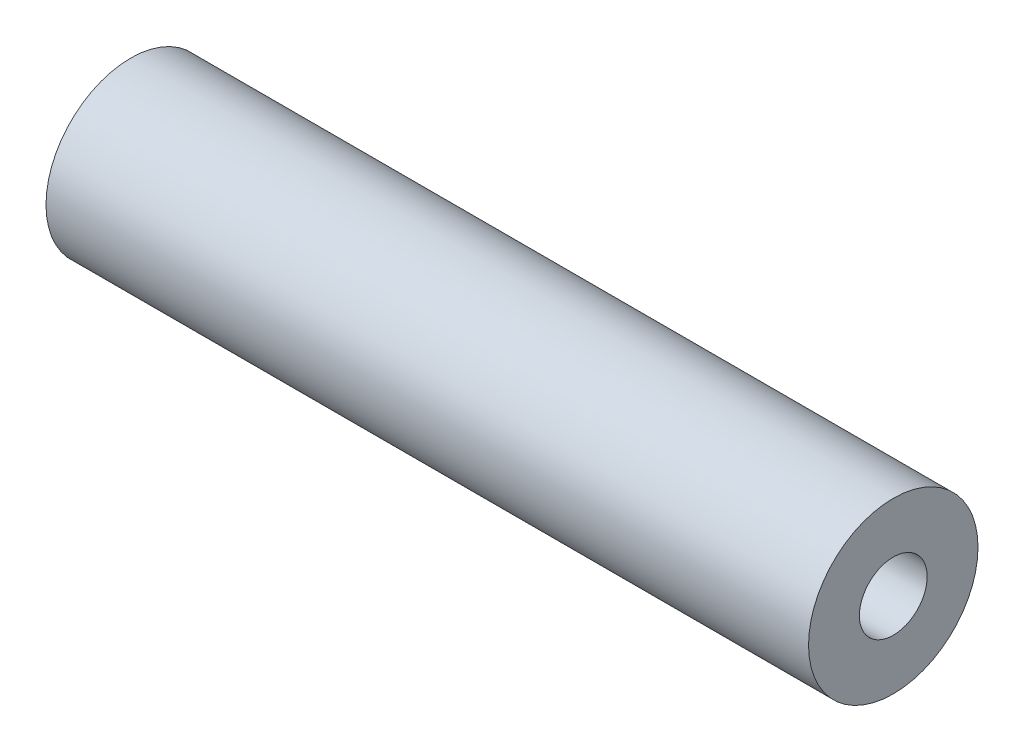
ISO-10303-21;
HEADER;
FILE_DESCRIPTION(('STEP AP214'),'2;1');
FILE_NAME('part.step','',(''),(''),'','','');
FILE_SCHEMA(('AUTOMOTIVE_DESIGN { 1 0 10303 214 1 1 1 1 }'));
ENDSEC;
DATA;
#1=APPLICATION_CONTEXT('core data for automotive mechanical design processes');
#2=APPLICATION_PROTOCOL_DEFINITION('international standard','automotive_design',2000,#1);
#3=PRODUCT_CONTEXT('',#1,'mechanical');
#4=PRODUCT('Part','Part','',(#3));
#5=PRODUCT_RELATED_PRODUCT_CATEGORY('part','',(#4));
#6=PRODUCT_DEFINITION_FORMATION('','',#4);
#7=PRODUCT_DEFINITION_CONTEXT('part definition',#1,'design');
#8=PRODUCT_DEFINITION('design','',#6,#7);
#9=PRODUCT_DEFINITION_SHAPE('','',#8);
#10=(LENGTH_UNIT() NAMED_UNIT(*) SI_UNIT(.MILLI.,.METRE.));
#11=(NAMED_UNIT(*) PLANE_ANGLE_UNIT() SI_UNIT($,.RADIAN.));
#12=(NAMED_UNIT(*) SI_UNIT($,.STERADIAN.) SOLID_ANGLE_UNIT());
#13=UNCERTAINTY_MEASURE_WITH_UNIT(LENGTH_MEASURE(1.E-05),#10,'distance_accuracy_value','');
#14=(GEOMETRIC_REPRESENTATION_CONTEXT(3) GLOBAL_UNCERTAINTY_ASSIGNED_CONTEXT((#13)) GLOBAL_UNIT_ASSIGNED_CONTEXT((#10,
#11,#12)) REPRESENTATION_CONTEXT('',''));
#15=CARTESIAN_POINT('',(0.,0.,0.));
#16=DIRECTION('',(0.,0.,1.));
#17=DIRECTION('',(1.,0.,0.));
#18=AXIS2_PLACEMENT_3D('',#15,#16,#17);
#19=CARTESIAN_POINT('',(-45.,10.,0.));
#20=DIRECTION('',(1.,0.,0.));
#21=DIRECTION('',(0.,0.,-1.));
#22=AXIS2_PLACEMENT_3D('',#19,#20,#21);
#23=PLANE('',#22);
#24=CARTESIAN_POINT('',(-45.,0.,0.));
#25=DIRECTION('',(-1.,0.,0.));
#26=DIRECTION('',(0.,0.,1.));
#27=AXIS2_PLACEMENT_3D('',#24,#25,#26);
#28=CIRCLE('',#27,4.);
#29=CARTESIAN_POINT('',(-45.,0.,4.));
#30=VERTEX_POINT('',#29);
#31=EDGE_CURVE('E10',#30,#30,#28,.T.);
#32=ORIENTED_EDGE('',*,*,#31,.F.);
#33=EDGE_LOOP('',(#32));
#34=FACE_BOUND('',#33,.T.);
#35=CARTESIAN_POINT('',(-45.,0.,0.));
#36=DIRECTION('',(-1.,0.,0.));
#37=DIRECTION('',(0.,0.,1.));
#38=AXIS2_PLACEMENT_3D('',#35,#36,#37);
#39=CIRCLE('',#38,10.);
#40=CARTESIAN_POINT('',(-45.,0.,10.));
#41=VERTEX_POINT('',#40);
#42=EDGE_CURVE('E46',#41,#41,#39,.T.);
#43=ORIENTED_EDGE('',*,*,#42,.T.);
#44=EDGE_LOOP('',(#43));
#45=FACE_BOUND('',#44,.T.);
#46=ADVANCED_FACE('F32',(#34,#45),#23,.F.);
#47=CARTESIAN_POINT('',(0.,0.,0.));
#48=DIRECTION('',(-1.,0.,0.));
#49=DIRECTION('',(0.,0.,1.));
#50=AXIS2_PLACEMENT_3D('',#47,#48,#49);
#51=CYLINDRICAL_SURFACE('',#50,4.);
#52=CARTESIAN_POINT('',(45.,0.,0.));
#53=DIRECTION('',(-1.,0.,0.));
#54=DIRECTION('',(0.,0.,1.));
#55=AXIS2_PLACEMENT_3D('',#52,#53,#54);
#56=CIRCLE('',#55,4.);
#57=CARTESIAN_POINT('',(45.,0.,4.));
#58=VERTEX_POINT('',#57);
#59=EDGE_CURVE('E38',#58,#58,#56,.T.);
#60=ORIENTED_EDGE('',*,*,#59,.F.);
#61=EDGE_LOOP('',(#60));
#62=FACE_BOUND('',#61,.T.);
#63=ORIENTED_EDGE('',*,*,#31,.T.);
#64=EDGE_LOOP('',(#63));
#65=FACE_BOUND('',#64,.T.);
#66=ADVANCED_FACE('F61',(#62,#65),#51,.F.);
#67=CARTESIAN_POINT('',(45.,10.,0.));
#68=DIRECTION('',(-1.,0.,0.));
#69=DIRECTION('',(0.,0.,1.));
#70=AXIS2_PLACEMENT_3D('',#67,#68,#69);
#71=PLANE('',#70);
#72=CARTESIAN_POINT('',(45.,0.,0.));
#73=DIRECTION('',(-1.,0.,0.));
#74=DIRECTION('',(0.,0.,1.));
#75=AXIS2_PLACEMENT_3D('',#72,#73,#74);
#76=CIRCLE('',#75,10.);
#77=CARTESIAN_POINT('',(45.,0.,10.));
#78=VERTEX_POINT('',#77);
#79=EDGE_CURVE('E42',#78,#78,#76,.T.);
#80=ORIENTED_EDGE('',*,*,#79,.F.);
#81=EDGE_LOOP('',(#80));
#82=FACE_BOUND('',#81,.T.);
#83=ORIENTED_EDGE('',*,*,#59,.T.);
#84=EDGE_LOOP('',(#83));
#85=FACE_BOUND('',#84,.T.);
#86=ADVANCED_FACE('F56',(#82,#85),#71,.F.);
#87=CARTESIAN_POINT('',(0.,0.,0.));
#88=DIRECTION('',(-1.,0.,0.));
#89=DIRECTION('',(0.,0.,1.));
#90=AXIS2_PLACEMENT_3D('',#87,#88,#89);
#91=CYLINDRICAL_SURFACE('',#90,10.);
#92=ORIENTED_EDGE('',*,*,#42,.F.);
#93=EDGE_LOOP('',(#92));
#94=FACE_BOUND('',#93,.T.);
#95=ORIENTED_EDGE('',*,*,#79,.T.);
#96=EDGE_LOOP('',(#95));
#97=FACE_BOUND('',#96,.T.);
#98=ADVANCED_FACE('F53',(#94,#97),#91,.T.);
#99=CLOSED_SHELL('',(#46,#66,#86,#98));
#100=MANIFOLD_SOLID_BREP('B2',#99);
#101=ADVANCED_BREP_SHAPE_REPRESENTATION('',(#18,#100),#14);
#102=SHAPE_DEFINITION_REPRESENTATION(#9,#101);
ENDSEC;
END-ISO-10303-21;
